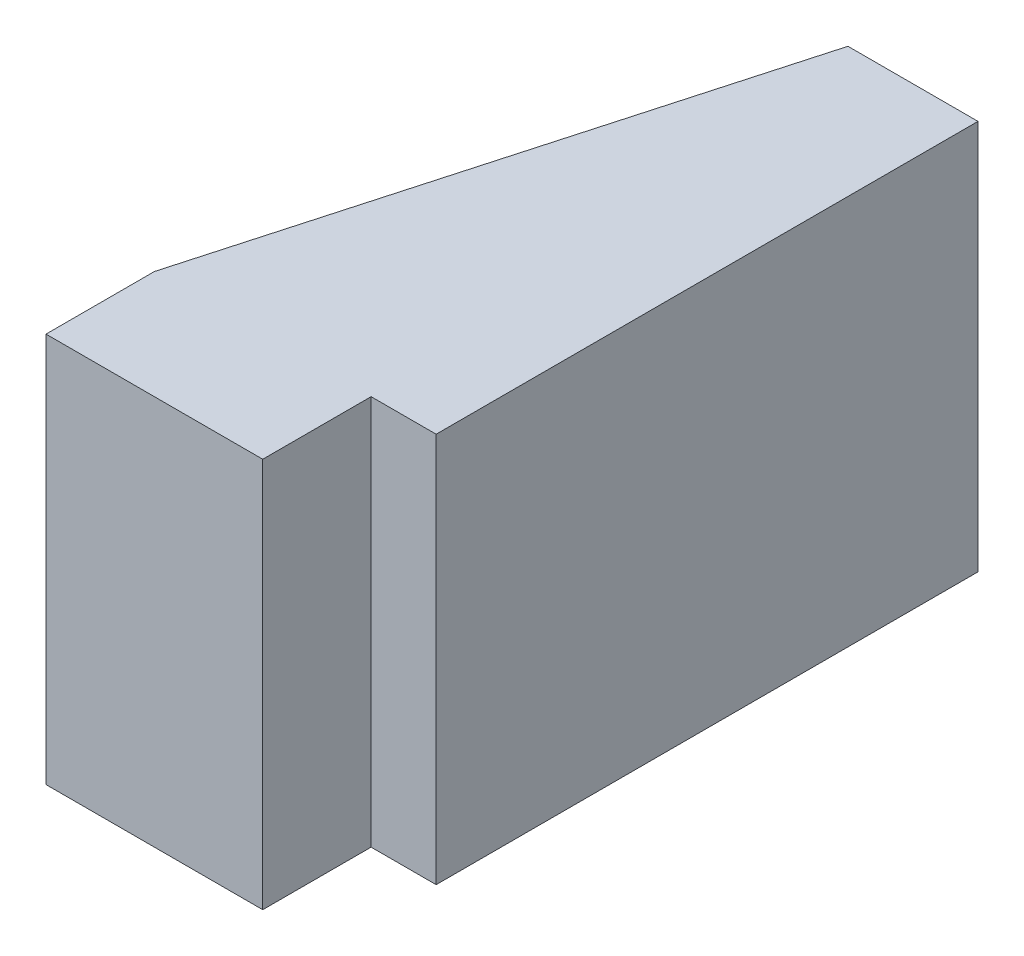
ISO-10303-21;
HEADER;
FILE_DESCRIPTION(('STEP AP214'),'2;1');
FILE_NAME('part.step','',(''),(''),'','','');
FILE_SCHEMA(('AUTOMOTIVE_DESIGN { 1 0 10303 214 1 1 1 1 }'));
ENDSEC;
DATA;
#1=APPLICATION_CONTEXT('core data for automotive mechanical design processes');
#2=APPLICATION_PROTOCOL_DEFINITION('international standard','automotive_design',2000,#1);
#3=PRODUCT_CONTEXT('',#1,'mechanical');
#4=PRODUCT('Part','Part','',(#3));
#5=PRODUCT_RELATED_PRODUCT_CATEGORY('part','',(#4));
#6=PRODUCT_DEFINITION_FORMATION('','',#4);
#7=PRODUCT_DEFINITION_CONTEXT('part definition',#1,'design');
#8=PRODUCT_DEFINITION('design','',#6,#7);
#9=PRODUCT_DEFINITION_SHAPE('','',#8);
#10=(LENGTH_UNIT() NAMED_UNIT(*) SI_UNIT(.MILLI.,.METRE.));
#11=(NAMED_UNIT(*) PLANE_ANGLE_UNIT() SI_UNIT($,.RADIAN.));
#12=(NAMED_UNIT(*) SI_UNIT($,.STERADIAN.) SOLID_ANGLE_UNIT());
#13=UNCERTAINTY_MEASURE_WITH_UNIT(LENGTH_MEASURE(1.E-05),#10,'distance_accuracy_value','');
#14=(GEOMETRIC_REPRESENTATION_CONTEXT(3) GLOBAL_UNCERTAINTY_ASSIGNED_CONTEXT((#13)) GLOBAL_UNIT_ASSIGNED_CONTEXT((#10,
#11,#12)) REPRESENTATION_CONTEXT('',''));
#15=CARTESIAN_POINT('',(0.,0.,0.));
#16=DIRECTION('',(0.,0.,1.));
#17=DIRECTION('',(1.,0.,0.));
#18=AXIS2_PLACEMENT_3D('',#15,#16,#17);
#19=CARTESIAN_POINT('',(9.87350835322194,18.,0.));
#20=DIRECTION('',(1.,0.,0.));
#21=DIRECTION('',(0.,0.,-1.));
#22=AXIS2_PLACEMENT_3D('',#19,#20,#21);
#23=PLANE('',#22);
#24=DIRECTION('',(0.,0.,1.));
#25=VECTOR('',#24,1.);
#26=CARTESIAN_POINT('',(9.87350835322194,0.,0.));
#27=LINE('',#26,#25);
#28=CARTESIAN_POINT('',(9.87350835322194,0.,-12.2076372315036));
#29=VERTEX_POINT('',#28);
#30=CARTESIAN_POINT('',(9.87350835322195,0.,12.7923627684964));
#31=VERTEX_POINT('',#30);
#32=EDGE_CURVE('E128',#29,#31,#27,.T.);
#33=ORIENTED_EDGE('',*,*,#32,.F.);
#34=DIRECTION('',(0.,-1.,0.));
#35=VECTOR('',#34,1.);
#36=CARTESIAN_POINT('',(9.87350835322194,18.,-12.2076372315036));
#37=LINE('',#36,#35);
#38=CARTESIAN_POINT('',(9.87350835322194,18.,-12.2076372315036));
#39=VERTEX_POINT('',#38);
#40=EDGE_CURVE('E11',#39,#29,#37,.T.);
#41=ORIENTED_EDGE('',*,*,#40,.F.);
#42=DIRECTION('',(0.,0.,1.));
#43=VECTOR('',#42,1.);
#44=CARTESIAN_POINT('',(9.87350835322194,18.,0.));
#45=LINE('',#44,#43);
#46=CARTESIAN_POINT('',(9.87350835322195,18.,12.7923627684964));
#47=VERTEX_POINT('',#46);
#48=EDGE_CURVE('E143',#39,#47,#45,.T.);
#49=ORIENTED_EDGE('',*,*,#48,.T.);
#50=DIRECTION('',(0.,-1.,0.));
#51=VECTOR('',#50,1.);
#52=CARTESIAN_POINT('',(9.87350835322195,18.,12.7923627684964));
#53=LINE('',#52,#51);
#54=EDGE_CURVE('E88',#47,#31,#53,.T.);
#55=ORIENTED_EDGE('',*,*,#54,.T.);
#56=EDGE_LOOP('',(#33,#41,#49,#55));
#57=FACE_BOUND('',#56,.T.);
#58=ADVANCED_FACE('F41',(#57),#23,.T.);
#59=CARTESIAN_POINT('',(0.,18.,-12.2076372315036));
#60=DIRECTION('',(0.,0.,-1.));
#61=DIRECTION('',(-1.,0.,0.));
#62=AXIS2_PLACEMENT_3D('',#59,#60,#61);
#63=PLANE('',#62);
#64=DIRECTION('',(1.,0.,0.));
#65=VECTOR('',#64,1.);
#66=CARTESIAN_POINT('',(0.,0.,-12.2076372315036));
#67=LINE('',#66,#65);
#68=CARTESIAN_POINT('',(3.87350835322195,0.,-12.2076372315036));
#69=VERTEX_POINT('',#68);
#70=EDGE_CURVE('E131',#69,#29,#67,.T.);
#71=ORIENTED_EDGE('',*,*,#70,.F.);
#72=DIRECTION('',(0.,-1.,0.));
#73=VECTOR('',#72,1.);
#74=CARTESIAN_POINT('',(3.87350835322195,18.,-12.2076372315036));
#75=LINE('',#74,#73);
#76=CARTESIAN_POINT('',(3.87350835322195,18.,-12.2076372315036));
#77=VERTEX_POINT('',#76);
#78=EDGE_CURVE('E49',#77,#69,#75,.T.);
#79=ORIENTED_EDGE('',*,*,#78,.F.);
#80=DIRECTION('',(1.,0.,0.));
#81=VECTOR('',#80,1.);
#82=CARTESIAN_POINT('',(0.,18.,-12.2076372315036));
#83=LINE('',#82,#81);
#84=EDGE_CURVE('E163',#77,#39,#83,.T.);
#85=ORIENTED_EDGE('',*,*,#84,.T.);
#86=ORIENTED_EDGE('',*,*,#40,.T.);
#87=EDGE_LOOP('',(#71,#79,#85,#86));
#88=FACE_BOUND('',#87,.T.);
#89=ADVANCED_FACE('F162',(#88),#63,.T.);
#90=CARTESIAN_POINT('',(0.422264399481587,18.,0.118234031854844));
#91=DIRECTION('',(0.962964019714182,0.,0.269629925519971));
#92=DIRECTION('',(0.269629925519971,0.,-0.962964019714182));
#93=AXIS2_PLACEMENT_3D('',#90,#91,#92);
#94=PLANE('',#93);
#95=DIRECTION('',(-0.269629925519971,0.,0.962964019714182));
#96=VECTOR('',#95,1.);
#97=CARTESIAN_POINT('',(0.422264399481587,0.,0.118234031854844));
#98=LINE('',#97,#96);
#99=CARTESIAN_POINT('',(-3.12649164677805,0.,12.7923627684964));
#100=VERTEX_POINT('',#99);
#101=EDGE_CURVE('E134',#69,#100,#98,.T.);
#102=ORIENTED_EDGE('',*,*,#101,.T.);
#103=DIRECTION('',(0.,-1.,0.));
#104=VECTOR('',#103,1.);
#105=CARTESIAN_POINT('',(-3.12649164677805,18.,12.7923627684964));
#106=LINE('',#105,#104);
#107=CARTESIAN_POINT('',(-3.12649164677805,18.,12.7923627684964));
#108=VERTEX_POINT('',#107);
#109=EDGE_CURVE('E147',#108,#100,#106,.T.);
#110=ORIENTED_EDGE('',*,*,#109,.F.);
#111=DIRECTION('',(-0.269629925519971,0.,0.962964019714182));
#112=VECTOR('',#111,1.);
#113=CARTESIAN_POINT('',(0.422264399481587,18.,0.118234031854844));
#114=LINE('',#113,#112);
#115=EDGE_CURVE('E154',#77,#108,#114,.T.);
#116=ORIENTED_EDGE('',*,*,#115,.F.);
#117=ORIENTED_EDGE('',*,*,#78,.T.);
#118=EDGE_LOOP('',(#102,#110,#116,#117));
#119=FACE_BOUND('',#118,.T.);
#120=ADVANCED_FACE('F152',(#119),#94,.F.);
#121=CARTESIAN_POINT('',(-3.12649164677805,18.,0.));
#122=DIRECTION('',(1.,0.,0.));
#123=DIRECTION('',(0.,0.,-1.));
#124=AXIS2_PLACEMENT_3D('',#121,#122,#123);
#125=PLANE('',#124);
#126=DIRECTION('',(0.,0.,1.));
#127=VECTOR('',#126,1.);
#128=CARTESIAN_POINT('',(-3.12649164677805,0.,0.));
#129=LINE('',#128,#127);
#130=CARTESIAN_POINT('',(-3.12649164677805,0.,17.7923627684964));
#131=VERTEX_POINT('',#130);
#132=EDGE_CURVE('E136',#100,#131,#129,.T.);
#133=ORIENTED_EDGE('',*,*,#132,.T.);
#134=DIRECTION('',(0.,-1.,0.));
#135=VECTOR('',#134,1.);
#136=CARTESIAN_POINT('',(-3.12649164677805,18.,17.7923627684964));
#137=LINE('',#136,#135);
#138=CARTESIAN_POINT('',(-3.12649164677805,18.,17.7923627684964));
#139=VERTEX_POINT('',#138);
#140=EDGE_CURVE('E121',#139,#131,#137,.T.);
#141=ORIENTED_EDGE('',*,*,#140,.F.);
#142=DIRECTION('',(0.,0.,1.));
#143=VECTOR('',#142,1.);
#144=CARTESIAN_POINT('',(-3.12649164677805,18.,0.));
#145=LINE('',#144,#143);
#146=EDGE_CURVE('E108',#108,#139,#145,.T.);
#147=ORIENTED_EDGE('',*,*,#146,.F.);
#148=ORIENTED_EDGE('',*,*,#109,.T.);
#149=EDGE_LOOP('',(#133,#141,#147,#148));
#150=FACE_BOUND('',#149,.T.);
#151=ADVANCED_FACE('F169',(#150),#125,.F.);
#152=CARTESIAN_POINT('',(0.,18.,17.7923627684964));
#153=DIRECTION('',(0.,0.,-1.));
#154=DIRECTION('',(-1.,0.,0.));
#155=AXIS2_PLACEMENT_3D('',#152,#153,#154);
#156=PLANE('',#155);
#157=DIRECTION('',(1.,0.,0.));
#158=VECTOR('',#157,1.);
#159=CARTESIAN_POINT('',(0.,0.,17.7923627684964));
#160=LINE('',#159,#158);
#161=CARTESIAN_POINT('',(6.87350835322195,0.,17.7923627684964));
#162=VERTEX_POINT('',#161);
#163=EDGE_CURVE('E117',#131,#162,#160,.T.);
#164=ORIENTED_EDGE('',*,*,#163,.T.);
#165=DIRECTION('',(0.,-1.,0.));
#166=VECTOR('',#165,1.);
#167=CARTESIAN_POINT('',(6.87350835322195,18.,17.7923627684964));
#168=LINE('',#167,#166);
#169=CARTESIAN_POINT('',(6.87350835322195,18.,17.7923627684964));
#170=VERTEX_POINT('',#169);
#171=EDGE_CURVE('E114',#170,#162,#168,.T.);
#172=ORIENTED_EDGE('',*,*,#171,.F.);
#173=DIRECTION('',(1.,0.,0.));
#174=VECTOR('',#173,1.);
#175=CARTESIAN_POINT('',(0.,18.,17.7923627684964));
#176=LINE('',#175,#174);
#177=EDGE_CURVE('E102',#139,#170,#176,.T.);
#178=ORIENTED_EDGE('',*,*,#177,.F.);
#179=ORIENTED_EDGE('',*,*,#140,.T.);
#180=EDGE_LOOP('',(#164,#172,#178,#179));
#181=FACE_BOUND('',#180,.T.);
#182=ADVANCED_FACE('F115',(#181),#156,.F.);
#183=CARTESIAN_POINT('',(6.87350835322194,18.,0.));
#184=DIRECTION('',(1.,0.,0.));
#185=DIRECTION('',(0.,0.,-1.));
#186=AXIS2_PLACEMENT_3D('',#183,#184,#185);
#187=PLANE('',#186);
#188=DIRECTION('',(0.,0.,1.));
#189=VECTOR('',#188,1.);
#190=CARTESIAN_POINT('',(6.87350835322194,0.,0.));
#191=LINE('',#190,#189);
#192=CARTESIAN_POINT('',(6.87350835322194,0.,12.7923627684964));
#193=VERTEX_POINT('',#192);
#194=EDGE_CURVE('E139',#193,#162,#191,.T.);
#195=ORIENTED_EDGE('',*,*,#194,.F.);
#196=DIRECTION('',(0.,-1.,0.));
#197=VECTOR('',#196,1.);
#198=CARTESIAN_POINT('',(6.87350835322194,18.,12.7923627684964));
#199=LINE('',#198,#197);
#200=CARTESIAN_POINT('',(6.87350835322194,18.,12.7923627684964));
#201=VERTEX_POINT('',#200);
#202=EDGE_CURVE('E81',#201,#193,#199,.T.);
#203=ORIENTED_EDGE('',*,*,#202,.F.);
#204=DIRECTION('',(0.,0.,1.));
#205=VECTOR('',#204,1.);
#206=CARTESIAN_POINT('',(6.87350835322194,18.,0.));
#207=LINE('',#206,#205);
#208=EDGE_CURVE('E106',#201,#170,#207,.T.);
#209=ORIENTED_EDGE('',*,*,#208,.T.);
#210=ORIENTED_EDGE('',*,*,#171,.T.);
#211=EDGE_LOOP('',(#195,#203,#209,#210));
#212=FACE_BOUND('',#211,.T.);
#213=ADVANCED_FACE('F123',(#212),#187,.T.);
#214=CARTESIAN_POINT('',(0.,18.,12.7923627684964));
#215=DIRECTION('',(0.,0.,-1.));
#216=DIRECTION('',(-1.,0.,0.));
#217=AXIS2_PLACEMENT_3D('',#214,#215,#216);
#218=PLANE('',#217);
#219=DIRECTION('',(1.,0.,0.));
#220=VECTOR('',#219,1.);
#221=CARTESIAN_POINT('',(0.,0.,12.7923627684964));
#222=LINE('',#221,#220);
#223=EDGE_CURVE('E141',#193,#31,#222,.T.);
#224=ORIENTED_EDGE('',*,*,#223,.T.);
#225=ORIENTED_EDGE('',*,*,#54,.F.);
#226=DIRECTION('',(1.,0.,0.));
#227=VECTOR('',#226,1.);
#228=CARTESIAN_POINT('',(0.,18.,12.7923627684964));
#229=LINE('',#228,#227);
#230=EDGE_CURVE('E57',#201,#47,#229,.T.);
#231=ORIENTED_EDGE('',*,*,#230,.F.);
#232=ORIENTED_EDGE('',*,*,#202,.T.);
#233=EDGE_LOOP('',(#224,#225,#231,#232));
#234=FACE_BOUND('',#233,.T.);
#235=ADVANCED_FACE('F164',(#234),#218,.F.);
#236=CARTESIAN_POINT('',(0.,18.,0.));
#237=DIRECTION('',(0.,1.,0.));
#238=DIRECTION('',(0.,0.,1.));
#239=AXIS2_PLACEMENT_3D('',#236,#237,#238);
#240=PLANE('',#239);
#241=ORIENTED_EDGE('',*,*,#48,.F.);
#242=ORIENTED_EDGE('',*,*,#84,.F.);
#243=ORIENTED_EDGE('',*,*,#115,.T.);
#244=ORIENTED_EDGE('',*,*,#146,.T.);
#245=ORIENTED_EDGE('',*,*,#177,.T.);
#246=ORIENTED_EDGE('',*,*,#208,.F.);
#247=ORIENTED_EDGE('',*,*,#230,.T.);
#248=EDGE_LOOP('',(#241,#242,#243,#244,#245,#246,#247));
#249=FACE_BOUND('',#248,.T.);
#250=ADVANCED_FACE('F104',(#249),#240,.T.);
#251=CARTESIAN_POINT('',(0.,0.,0.));
#252=DIRECTION('',(0.,1.,0.));
#253=DIRECTION('',(0.,0.,1.));
#254=AXIS2_PLACEMENT_3D('',#251,#252,#253);
#255=PLANE('',#254);
#256=ORIENTED_EDGE('',*,*,#32,.T.);
#257=ORIENTED_EDGE('',*,*,#223,.F.);
#258=ORIENTED_EDGE('',*,*,#194,.T.);
#259=ORIENTED_EDGE('',*,*,#163,.F.);
#260=ORIENTED_EDGE('',*,*,#132,.F.);
#261=ORIENTED_EDGE('',*,*,#101,.F.);
#262=ORIENTED_EDGE('',*,*,#70,.T.);
#263=EDGE_LOOP('',(#256,#257,#258,#259,#260,#261,#262));
#264=FACE_BOUND('',#263,.T.);
#265=ADVANCED_FACE('F161',(#264),#255,.F.);
#266=CLOSED_SHELL('',(#58,#89,#120,#151,#182,#213,#235,#250,#265));
#267=MANIFOLD_SOLID_BREP('B2',#266);
#268=ADVANCED_BREP_SHAPE_REPRESENTATION('',(#18,#267),#14);
#269=SHAPE_DEFINITION_REPRESENTATION(#9,#268);
ENDSEC;
END-ISO-10303-21;
